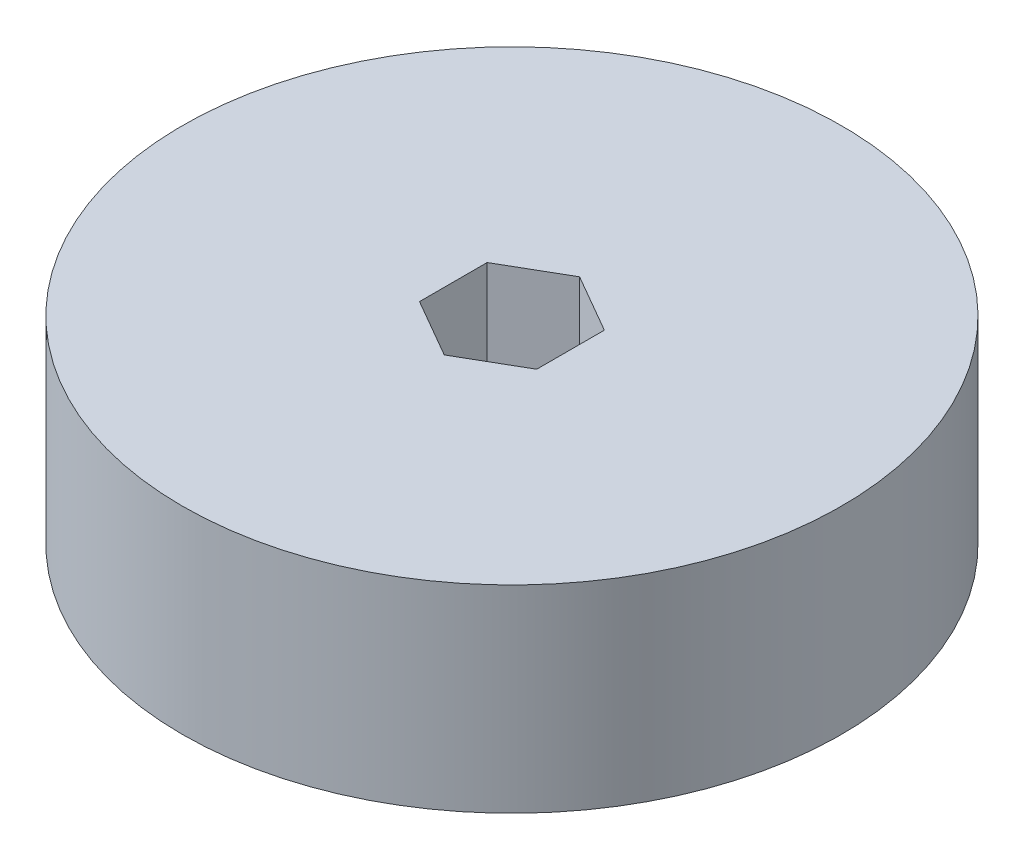
ISO-10303-21;
HEADER;
FILE_DESCRIPTION(('STEP AP214'),'2;1');
FILE_NAME('part.step','',(''),(''),'','','');
FILE_SCHEMA(('AUTOMOTIVE_DESIGN { 1 0 10303 214 1 1 1 1 }'));
ENDSEC;
DATA;
#1=APPLICATION_CONTEXT('core data for automotive mechanical design processes');
#2=APPLICATION_PROTOCOL_DEFINITION('international standard','automotive_design',2000,#1);
#3=PRODUCT_CONTEXT('',#1,'mechanical');
#4=PRODUCT('Part','Part','',(#3));
#5=PRODUCT_RELATED_PRODUCT_CATEGORY('part','',(#4));
#6=PRODUCT_DEFINITION_FORMATION('','',#4);
#7=PRODUCT_DEFINITION_CONTEXT('part definition',#1,'design');
#8=PRODUCT_DEFINITION('design','',#6,#7);
#9=PRODUCT_DEFINITION_SHAPE('','',#8);
#10=(LENGTH_UNIT() NAMED_UNIT(*) SI_UNIT(.MILLI.,.METRE.));
#11=(NAMED_UNIT(*) PLANE_ANGLE_UNIT() SI_UNIT($,.RADIAN.));
#12=(NAMED_UNIT(*) SI_UNIT($,.STERADIAN.) SOLID_ANGLE_UNIT());
#13=UNCERTAINTY_MEASURE_WITH_UNIT(LENGTH_MEASURE(1.E-05),#10,'distance_accuracy_value','');
#14=(GEOMETRIC_REPRESENTATION_CONTEXT(3) GLOBAL_UNCERTAINTY_ASSIGNED_CONTEXT((#13)) GLOBAL_UNIT_ASSIGNED_CONTEXT((#10,
#11,#12)) REPRESENTATION_CONTEXT('',''));
#15=CARTESIAN_POINT('',(0.,0.,0.));
#16=DIRECTION('',(0.,0.,1.));
#17=DIRECTION('',(1.,0.,0.));
#18=AXIS2_PLACEMENT_3D('',#15,#16,#17);
#19=CARTESIAN_POINT('',(4.44499999999999,-0.000999999999999265,-2.56632194654789));
#20=DIRECTION('',(0.5,0.,-0.866025403784439));
#21=DIRECTION('',(-0.866025403784439,0.,-0.5));
#22=AXIS2_PLACEMENT_3D('',#19,#20,#21);
#23=PLANE('',#22);
#24=DIRECTION('',(-0.866025403784439,0.,-0.5));
#25=VECTOR('',#24,1.);
#26=CARTESIAN_POINT('',(4.44499999999999,5.,-2.56632194654789));
#27=LINE('',#26,#25);
#28=CARTESIAN_POINT('',(4.44499999999999,5.,-2.56632194654789));
#29=VERTEX_POINT('',#28);
#30=CARTESIAN_POINT('',(0.,4.99999999999999,-5.13264389309577));
#31=VERTEX_POINT('',#30);
#32=EDGE_CURVE('E62',#29,#31,#27,.T.);
#33=ORIENTED_EDGE('',*,*,#32,.F.);
#34=DIRECTION('',(0.,1.,0.));
#35=VECTOR('',#34,1.);
#36=CARTESIAN_POINT('',(4.44499999999999,-0.000999999999999265,-2.56632194654789));
#37=LINE('',#36,#35);
#38=CARTESIAN_POINT('',(4.44499999999999,15.,-2.56632194654789));
#39=VERTEX_POINT('',#38);
#40=EDGE_CURVE('E375',#29,#39,#37,.T.);
#41=ORIENTED_EDGE('',*,*,#40,.T.);
#42=DIRECTION('',(-0.866025403784439,0.,-0.5));
#43=VECTOR('',#42,1.);
#44=CARTESIAN_POINT('',(4.44499999999999,15.,-2.56632194654789));
#45=LINE('',#44,#43);
#46=CARTESIAN_POINT('',(0.,15.,-5.13264389309577));
#47=VERTEX_POINT('',#46);
#48=EDGE_CURVE('E350',#39,#47,#45,.T.);
#49=ORIENTED_EDGE('',*,*,#48,.T.);
#50=DIRECTION('',(0.,1.,0.));
#51=VECTOR('',#50,1.);
#52=CARTESIAN_POINT('',(0.,-0.000999999999999265,-5.13264389309577));
#53=LINE('',#52,#51);
#54=EDGE_CURVE('E374',#31,#47,#53,.T.);
#55=ORIENTED_EDGE('',*,*,#54,.F.);
#56=EDGE_LOOP('',(#33,#41,#49,#55));
#57=FACE_BOUND('',#56,.T.);
#58=ADVANCED_FACE('F39',(#57),#23,.F.);
#59=CARTESIAN_POINT('',(4.44499999999999,-0.000999999999999265,2.56632194654789));
#60=DIRECTION('',(1.,0.,0.));
#61=DIRECTION('',(0.,0.,-1.));
#62=AXIS2_PLACEMENT_3D('',#59,#60,#61);
#63=PLANE('',#62);
#64=DIRECTION('',(0.,0.,-1.));
#65=VECTOR('',#64,1.);
#66=CARTESIAN_POINT('',(4.44499999999999,5.,2.56632194654789));
#67=LINE('',#66,#65);
#68=CARTESIAN_POINT('',(4.44499999999999,5.,2.56632194654789));
#69=VERTEX_POINT('',#68);
#70=EDGE_CURVE('E345',#69,#29,#67,.T.);
#71=ORIENTED_EDGE('',*,*,#70,.F.);
#72=DIRECTION('',(0.,1.,0.));
#73=VECTOR('',#72,1.);
#74=CARTESIAN_POINT('',(4.44499999999999,-0.000999999999999265,2.56632194654789));
#75=LINE('',#74,#73);
#76=CARTESIAN_POINT('',(4.44499999999999,15.,2.56632194654789));
#77=VERTEX_POINT('',#76);
#78=EDGE_CURVE('E379',#69,#77,#75,.T.);
#79=ORIENTED_EDGE('',*,*,#78,.T.);
#80=DIRECTION('',(0.,0.,-1.));
#81=VECTOR('',#80,1.);
#82=CARTESIAN_POINT('',(4.44499999999999,15.,2.56632194654789));
#83=LINE('',#82,#81);
#84=EDGE_CURVE('E370',#77,#39,#83,.T.);
#85=ORIENTED_EDGE('',*,*,#84,.T.);
#86=ORIENTED_EDGE('',*,*,#40,.F.);
#87=EDGE_LOOP('',(#71,#79,#85,#86));
#88=FACE_BOUND('',#87,.T.);
#89=ADVANCED_FACE('F412',(#88),#63,.F.);
#90=CARTESIAN_POINT('',(0.,-0.000999999999999265,5.13264389309577));
#91=DIRECTION('',(0.5,0.,0.866025403784438));
#92=DIRECTION('',(0.866025403784438,0.,-0.500000000000001));
#93=AXIS2_PLACEMENT_3D('',#90,#91,#92);
#94=PLANE('',#93);
#95=DIRECTION('',(0.866025403784438,0.,-0.500000000000001));
#96=VECTOR('',#95,1.);
#97=CARTESIAN_POINT('',(0.,5.,5.13264389309577));
#98=LINE('',#97,#96);
#99=CARTESIAN_POINT('',(0.,5.,5.13264389309577));
#100=VERTEX_POINT('',#99);
#101=EDGE_CURVE('E342',#100,#69,#98,.T.);
#102=ORIENTED_EDGE('',*,*,#101,.F.);
#103=DIRECTION('',(0.,1.,0.));
#104=VECTOR('',#103,1.);
#105=CARTESIAN_POINT('',(0.,-0.000999999999999265,5.13264389309577));
#106=LINE('',#105,#104);
#107=CARTESIAN_POINT('',(0.,15.,5.13264389309577));
#108=VERTEX_POINT('',#107);
#109=EDGE_CURVE('E382',#100,#108,#106,.T.);
#110=ORIENTED_EDGE('',*,*,#109,.T.);
#111=DIRECTION('',(0.866025403784438,0.,-0.5));
#112=VECTOR('',#111,1.);
#113=CARTESIAN_POINT('',(0.,15.,5.13264389309577));
#114=LINE('',#113,#112);
#115=EDGE_CURVE('E366',#108,#77,#114,.T.);
#116=ORIENTED_EDGE('',*,*,#115,.T.);
#117=ORIENTED_EDGE('',*,*,#78,.F.);
#118=EDGE_LOOP('',(#102,#110,#116,#117));
#119=FACE_BOUND('',#118,.T.);
#120=ADVANCED_FACE('F418',(#119),#94,.F.);
#121=CARTESIAN_POINT('',(-4.44500000000001,-0.000999999999999265,2.56632194654789));
#122=DIRECTION('',(-0.5,0.,0.866025403784439));
#123=DIRECTION('',(0.866025403784439,0.,0.5));
#124=AXIS2_PLACEMENT_3D('',#121,#122,#123);
#125=PLANE('',#124);
#126=DIRECTION('',(0.866025403784439,0.,0.5));
#127=VECTOR('',#126,1.);
#128=CARTESIAN_POINT('',(-4.44500000000001,5.,2.56632194654789));
#129=LINE('',#128,#127);
#130=CARTESIAN_POINT('',(-4.44500000000001,5.,2.56632194654789));
#131=VERTEX_POINT('',#130);
#132=EDGE_CURVE('E339',#131,#100,#129,.T.);
#133=ORIENTED_EDGE('',*,*,#132,.F.);
#134=DIRECTION('',(0.,1.,0.));
#135=VECTOR('',#134,1.);
#136=CARTESIAN_POINT('',(-4.44500000000001,-0.000999999999999265,2.56632194654789));
#137=LINE('',#136,#135);
#138=CARTESIAN_POINT('',(-4.44500000000001,15.,2.56632194654789));
#139=VERTEX_POINT('',#138);
#140=EDGE_CURVE('E385',#131,#139,#137,.T.);
#141=ORIENTED_EDGE('',*,*,#140,.T.);
#142=DIRECTION('',(0.866025403784439,0.,0.5));
#143=VECTOR('',#142,1.);
#144=CARTESIAN_POINT('',(-4.44500000000001,15.,2.56632194654789));
#145=LINE('',#144,#143);
#146=EDGE_CURVE('E362',#139,#108,#145,.T.);
#147=ORIENTED_EDGE('',*,*,#146,.T.);
#148=ORIENTED_EDGE('',*,*,#109,.F.);
#149=EDGE_LOOP('',(#133,#141,#147,#148));
#150=FACE_BOUND('',#149,.T.);
#151=ADVANCED_FACE('F429',(#150),#125,.F.);
#152=CARTESIAN_POINT('',(-4.44500000000001,-0.000999999999999265,-2.56632194654788));
#153=DIRECTION('',(-1.,0.,0.));
#154=DIRECTION('',(0.,0.,1.));
#155=AXIS2_PLACEMENT_3D('',#152,#153,#154);
#156=PLANE('',#155);
#157=DIRECTION('',(0.,0.,1.));
#158=VECTOR('',#157,1.);
#159=CARTESIAN_POINT('',(-4.44500000000001,5.,-2.56632194654788));
#160=LINE('',#159,#158);
#161=CARTESIAN_POINT('',(-4.44500000000001,5.,-2.56632194654788));
#162=VERTEX_POINT('',#161);
#163=EDGE_CURVE('E301',#162,#131,#160,.T.);
#164=ORIENTED_EDGE('',*,*,#163,.F.);
#165=DIRECTION('',(0.,1.,0.));
#166=VECTOR('',#165,1.);
#167=CARTESIAN_POINT('',(-4.44500000000001,-0.000999999999999265,-2.56632194654788));
#168=LINE('',#167,#166);
#169=CARTESIAN_POINT('',(-4.44500000000001,15.,-2.56632194654788));
#170=VERTEX_POINT('',#169);
#171=EDGE_CURVE('E388',#162,#170,#168,.T.);
#172=ORIENTED_EDGE('',*,*,#171,.T.);
#173=DIRECTION('',(0.,0.,1.));
#174=VECTOR('',#173,1.);
#175=CARTESIAN_POINT('',(-4.44500000000001,15.,-2.56632194654788));
#176=LINE('',#175,#174);
#177=EDGE_CURVE('E358',#170,#139,#176,.T.);
#178=ORIENTED_EDGE('',*,*,#177,.T.);
#179=ORIENTED_EDGE('',*,*,#140,.F.);
#180=EDGE_LOOP('',(#164,#172,#178,#179));
#181=FACE_BOUND('',#180,.T.);
#182=ADVANCED_FACE('F425',(#181),#156,.F.);
#183=CARTESIAN_POINT('',(0.,-0.000999999999999265,-5.13264389309577));
#184=DIRECTION('',(-0.500000000000001,0.,-0.866025403784438));
#185=DIRECTION('',(-0.866025403784438,0.,0.500000000000001));
#186=AXIS2_PLACEMENT_3D('',#183,#184,#185);
#187=PLANE('',#186);
#188=DIRECTION('',(-0.866025403784438,0.,0.500000000000001));
#189=VECTOR('',#188,1.);
#190=CARTESIAN_POINT('',(0.,5.,-5.13264389309577));
#191=LINE('',#190,#189);
#192=EDGE_CURVE('E11',#31,#162,#191,.T.);
#193=ORIENTED_EDGE('',*,*,#192,.F.);
#194=ORIENTED_EDGE('',*,*,#54,.T.);
#195=DIRECTION('',(-0.866025403784438,0.,0.500000000000001));
#196=VECTOR('',#195,1.);
#197=CARTESIAN_POINT('',(0.,15.,-5.13264389309577));
#198=LINE('',#197,#196);
#199=EDGE_CURVE('E354',#47,#170,#198,.T.);
#200=ORIENTED_EDGE('',*,*,#199,.T.);
#201=ORIENTED_EDGE('',*,*,#171,.F.);
#202=EDGE_LOOP('',(#193,#194,#200,#201));
#203=FACE_BOUND('',#202,.T.);
#204=ADVANCED_FACE('F422',(#203),#187,.F.);
#205=CARTESIAN_POINT('',(0.,15.,0.));
#206=DIRECTION('',(0.,-1.,0.));
#207=DIRECTION('',(0.,0.,-1.));
#208=AXIS2_PLACEMENT_3D('',#205,#206,#207);
#209=CYLINDRICAL_SURFACE('',#208,25.);
#210=CARTESIAN_POINT('',(0.,15.,0.));
#211=DIRECTION('',(0.,1.,0.));
#212=DIRECTION('',(0.,0.,1.));
#213=AXIS2_PLACEMENT_3D('',#210,#211,#212);
#214=CIRCLE('',#213,25.);
#215=CARTESIAN_POINT('',(0.,15.,25.));
#216=VERTEX_POINT('',#215);
#217=EDGE_CURVE('E48',#216,#216,#214,.T.);
#218=ORIENTED_EDGE('',*,*,#217,.F.);
#219=EDGE_LOOP('',(#218));
#220=FACE_BOUND('',#219,.T.);
#221=CARTESIAN_POINT('',(0.,0.,0.));
#222=DIRECTION('',(0.,1.,0.));
#223=DIRECTION('',(0.,0.,1.));
#224=AXIS2_PLACEMENT_3D('',#221,#222,#223);
#225=CIRCLE('',#224,25.);
#226=CARTESIAN_POINT('',(0.,0.,25.));
#227=VERTEX_POINT('',#226);
#228=EDGE_CURVE('E378',#227,#227,#225,.T.);
#229=ORIENTED_EDGE('',*,*,#228,.T.);
#230=EDGE_LOOP('',(#229));
#231=FACE_BOUND('',#230,.T.);
#232=ADVANCED_FACE('F41',(#220,#231),#209,.T.);
#233=CARTESIAN_POINT('',(0.,15.,0.));
#234=DIRECTION('',(0.,1.,0.));
#235=DIRECTION('',(0.,0.,1.));
#236=AXIS2_PLACEMENT_3D('',#233,#234,#235);
#237=PLANE('',#236);
#238=ORIENTED_EDGE('',*,*,#48,.F.);
#239=ORIENTED_EDGE('',*,*,#84,.F.);
#240=ORIENTED_EDGE('',*,*,#115,.F.);
#241=ORIENTED_EDGE('',*,*,#146,.F.);
#242=ORIENTED_EDGE('',*,*,#177,.F.);
#243=ORIENTED_EDGE('',*,*,#199,.F.);
#244=EDGE_LOOP('',(#238,#239,#240,#241,#242,#243));
#245=FACE_BOUND('',#244,.T.);
#246=ORIENTED_EDGE('',*,*,#217,.T.);
#247=EDGE_LOOP('',(#246));
#248=FACE_BOUND('',#247,.T.);
#249=ADVANCED_FACE('F402',(#245,#248),#237,.T.);
#250=CARTESIAN_POINT('',(0.,0.,0.));
#251=DIRECTION('',(0.,1.,0.));
#252=DIRECTION('',(0.,0.,1.));
#253=AXIS2_PLACEMENT_3D('',#250,#251,#252);
#254=PLANE('',#253);
#255=CARTESIAN_POINT('',(17.8847290850349,0.,-0.56107491716859));
#256=DIRECTION('',(0.,-1.,0.));
#257=DIRECTION('',(0.,0.,1.));
#258=AXIS2_PLACEMENT_3D('',#255,#256,#257);
#259=CIRCLE('',#258,3.11643938542762);
#260=CARTESIAN_POINT('',(21.,0.,-0.475742804709889));
#261=VERTEX_POINT('',#260);
#262=CARTESIAN_POINT('',(17.4455022656401,0.,2.52425719529011));
#263=VERTEX_POINT('',#262);
#264=EDGE_CURVE('E252',#261,#263,#259,.T.);
#265=ORIENTED_EDGE('',*,*,#264,.F.);
#266=CARTESIAN_POINT('',(17.8847290850349,0.,-0.390410692251188));
#267=DIRECTION('',(0.,-1.,0.));
#268=DIRECTION('',(0.,0.,-1.));
#269=AXIS2_PLACEMENT_3D('',#266,#267,#268);
#270=CIRCLE('',#269,3.11643938542762);
#271=CARTESIAN_POINT('',(17.4455022656401,0.,-3.47574280470989));
#272=VERTEX_POINT('',#271);
#273=EDGE_CURVE('E55',#272,#261,#270,.T.);
#274=ORIENTED_EDGE('',*,*,#273,.F.);
#275=CARTESIAN_POINT('',(-5.20599883220903,0.,107.75707594731));
#276=DIRECTION('',(0.,-1.,0.));
#277=DIRECTION('',(0.,0.,-1.));
#278=AXIS2_PLACEMENT_3D('',#275,#276,#277);
#279=CIRCLE('',#278,113.51577189759);
#280=CARTESIAN_POINT('',(8.10347319825867,0.,-4.97574280470988));
#281=VERTEX_POINT('',#280);
#282=EDGE_CURVE('E200',#281,#272,#279,.T.);
#283=ORIENTED_EDGE('',*,*,#282,.F.);
#284=CARTESIAN_POINT('',(-3.64270437307684,0.,15.1171715814549));
#285=DIRECTION('',(0.,-1.,0.));
#286=DIRECTION('',(0.,0.,-1.));
#287=AXIS2_PLACEMENT_3D('',#284,#285,#286);
#288=CIRCLE('',#287,23.2744043117561);
#289=CARTESIAN_POINT('',(2.86783245125889,0.,-7.22809204030758));
#290=VERTEX_POINT('',#289);
#291=EDGE_CURVE('E204',#290,#281,#288,.T.);
#292=ORIENTED_EDGE('',*,*,#291,.F.);
#293=CARTESIAN_POINT('',(0.,0.,-0.951485609419784));
#294=DIRECTION('',(0.,-1.,0.));
#295=DIRECTION('',(0.,0.,-1.));
#296=AXIS2_PLACEMENT_3D('',#293,#294,#295);
#297=CIRCLE('',#296,6.90074280470991);
#298=CARTESIAN_POINT('',(-2.86783245125889,0.,-7.22809204030758));
#299=VERTEX_POINT('',#298);
#300=EDGE_CURVE('E291',#299,#290,#297,.T.);
#301=ORIENTED_EDGE('',*,*,#300,.F.);
#302=CARTESIAN_POINT('',(3.64270437307683,0.,15.1171715814549));
#303=DIRECTION('',(0.,-1.,0.));
#304=DIRECTION('',(0.,0.,1.));
#305=AXIS2_PLACEMENT_3D('',#302,#303,#304);
#306=CIRCLE('',#305,23.2744043117561);
#307=CARTESIAN_POINT('',(-8.10347319825865,0.,-4.97574280470987));
#308=VERTEX_POINT('',#307);
#309=EDGE_CURVE('E287',#308,#299,#306,.T.);
#310=ORIENTED_EDGE('',*,*,#309,.F.);
#311=CARTESIAN_POINT('',(5.20599883220902,0.,107.75707594731));
#312=DIRECTION('',(0.,-1.,0.));
#313=DIRECTION('',(0.,0.,1.));
#314=AXIS2_PLACEMENT_3D('',#311,#312,#313);
#315=CIRCLE('',#314,113.51577189759);
#316=CARTESIAN_POINT('',(-17.4455022656401,0.,-3.47574280470989));
#317=VERTEX_POINT('',#316);
#318=EDGE_CURVE('E283',#317,#308,#315,.T.);
#319=ORIENTED_EDGE('',*,*,#318,.F.);
#320=CARTESIAN_POINT('',(-17.8847290850349,0.,-0.390410692251189));
#321=DIRECTION('',(0.,-1.,0.));
#322=DIRECTION('',(0.,0.,1.));
#323=AXIS2_PLACEMENT_3D('',#320,#321,#322);
#324=CIRCLE('',#323,3.11643938542762);
#325=CARTESIAN_POINT('',(-21.,0.,-0.475742804709896));
#326=VERTEX_POINT('',#325);
#327=EDGE_CURVE('E279',#326,#317,#324,.T.);
#328=ORIENTED_EDGE('',*,*,#327,.F.);
#329=CARTESIAN_POINT('',(-17.8847290850349,0.,-0.561074917168592));
#330=DIRECTION('',(0.,-1.,0.));
#331=DIRECTION('',(0.,0.,-1.));
#332=AXIS2_PLACEMENT_3D('',#329,#330,#331);
#333=CIRCLE('',#332,3.11643938542762);
#334=CARTESIAN_POINT('',(-17.4455022656401,0.,2.52425719529011));
#335=VERTEX_POINT('',#334);
#336=EDGE_CURVE('E275',#335,#326,#333,.T.);
#337=ORIENTED_EDGE('',*,*,#336,.F.);
#338=CARTESIAN_POINT('',(5.20599883220902,0.,-108.70856155673));
#339=DIRECTION('',(0.,-1.,0.));
#340=DIRECTION('',(0.,0.,-1.));
#341=AXIS2_PLACEMENT_3D('',#338,#339,#340);
#342=CIRCLE('',#341,113.51577189759);
#343=CARTESIAN_POINT('',(-8.10347319825867,0.,4.0242571952901));
#344=VERTEX_POINT('',#343);
#345=EDGE_CURVE('E271',#344,#335,#342,.T.);
#346=ORIENTED_EDGE('',*,*,#345,.F.);
#347=CARTESIAN_POINT('',(3.64270437307683,0.,-16.0686571908747));
#348=DIRECTION('',(0.,-1.,0.));
#349=DIRECTION('',(0.,0.,-1.));
#350=AXIS2_PLACEMENT_3D('',#347,#348,#349);
#351=CIRCLE('',#350,23.2744043117561);
#352=CARTESIAN_POINT('',(-2.86783245125889,0.,6.2766064308878));
#353=VERTEX_POINT('',#352);
#354=EDGE_CURVE('E267',#353,#344,#351,.T.);
#355=ORIENTED_EDGE('',*,*,#354,.F.);
#356=CARTESIAN_POINT('',(0.,0.,0.));
#357=DIRECTION('',(0.,-1.,0.));
#358=DIRECTION('',(0.,0.,-1.));
#359=AXIS2_PLACEMENT_3D('',#356,#357,#358);
#360=CIRCLE('',#359,6.90074280470991);
#361=CARTESIAN_POINT('',(2.86783245125889,0.,6.27660643088779));
#362=VERTEX_POINT('',#361);
#363=EDGE_CURVE('E263',#362,#353,#360,.T.);
#364=ORIENTED_EDGE('',*,*,#363,.F.);
#365=CARTESIAN_POINT('',(-3.64270437307683,0.,-16.0686571908747));
#366=DIRECTION('',(0.,-1.,0.));
#367=DIRECTION('',(0.,0.,1.));
#368=AXIS2_PLACEMENT_3D('',#365,#366,#367);
#369=CIRCLE('',#368,23.2744043117561);
#370=CARTESIAN_POINT('',(8.10347319825868,0.,4.02425719529009));
#371=VERTEX_POINT('',#370);
#372=EDGE_CURVE('E259',#371,#362,#369,.T.);
#373=ORIENTED_EDGE('',*,*,#372,.F.);
#374=CARTESIAN_POINT('',(-5.20599883220902,0.,-108.70856155673));
#375=DIRECTION('',(0.,-1.,0.));
#376=DIRECTION('',(0.,0.,1.));
#377=AXIS2_PLACEMENT_3D('',#374,#375,#376);
#378=CIRCLE('',#377,113.51577189759);
#379=EDGE_CURVE('E255',#263,#371,#378,.T.);
#380=ORIENTED_EDGE('',*,*,#379,.F.);
#381=EDGE_LOOP('',(#265,#274,#283,#292,#301,#310,#319,#328,#337,#346,#355,#364,#373,#380));
#382=FACE_BOUND('',#381,.T.);
#383=ORIENTED_EDGE('',*,*,#228,.F.);
#384=EDGE_LOOP('',(#383));
#385=FACE_BOUND('',#384,.T.);
#386=ADVANCED_FACE('F400',(#382,#385),#254,.F.);
#387=CARTESIAN_POINT('',(17.8847290850349,5.,-0.475742804709889));
#388=DIRECTION('',(0.,-1.,0.));
#389=DIRECTION('',(0.,0.,-1.));
#390=AXIS2_PLACEMENT_3D('',#387,#388,#389);
#391=PLANE('',#390);
#392=CARTESIAN_POINT('',(17.8847290850349,5.,-0.390410692251188));
#393=DIRECTION('',(0.,-1.,0.));
#394=DIRECTION('',(0.,0.,-1.));
#395=AXIS2_PLACEMENT_3D('',#392,#393,#394);
#396=CIRCLE('',#395,3.11643938542762);
#397=CARTESIAN_POINT('',(17.4455022656401,5.,-3.47574280470989));
#398=VERTEX_POINT('',#397);
#399=CARTESIAN_POINT('',(21.,5.,-0.475742804709889));
#400=VERTEX_POINT('',#399);
#401=EDGE_CURVE('E178',#398,#400,#396,.T.);
#402=ORIENTED_EDGE('',*,*,#401,.T.);
#403=CARTESIAN_POINT('',(17.8847290850349,5.,-0.56107491716859));
#404=DIRECTION('',(0.,-1.,0.));
#405=DIRECTION('',(0.,0.,1.));
#406=AXIS2_PLACEMENT_3D('',#403,#404,#405);
#407=CIRCLE('',#406,3.11643938542762);
#408=CARTESIAN_POINT('',(17.4455022656401,5.,2.52425719529011));
#409=VERTEX_POINT('',#408);
#410=EDGE_CURVE('E188',#400,#409,#407,.T.);
#411=ORIENTED_EDGE('',*,*,#410,.T.);
#412=CARTESIAN_POINT('',(-5.20599883220902,5.,-108.70856155673));
#413=DIRECTION('',(0.,-1.,0.));
#414=DIRECTION('',(0.,0.,1.));
#415=AXIS2_PLACEMENT_3D('',#412,#413,#414);
#416=CIRCLE('',#415,113.51577189759);
#417=CARTESIAN_POINT('',(8.10347319825868,5.,4.02425719529009));
#418=VERTEX_POINT('',#417);
#419=EDGE_CURVE('E194',#409,#418,#416,.T.);
#420=ORIENTED_EDGE('',*,*,#419,.T.);
#421=CARTESIAN_POINT('',(-3.64270437307683,5.,-16.0686571908747));
#422=DIRECTION('',(0.,-1.,0.));
#423=DIRECTION('',(0.,0.,1.));
#424=AXIS2_PLACEMENT_3D('',#421,#422,#423);
#425=CIRCLE('',#424,23.2744043117561);
#426=CARTESIAN_POINT('',(2.86783245125889,5.,6.27660643088779));
#427=VERTEX_POINT('',#426);
#428=EDGE_CURVE('E209',#418,#427,#425,.T.);
#429=ORIENTED_EDGE('',*,*,#428,.T.);
#430=CARTESIAN_POINT('',(0.,5.,0.));
#431=DIRECTION('',(0.,-1.,0.));
#432=DIRECTION('',(0.,0.,-1.));
#433=AXIS2_PLACEMENT_3D('',#430,#431,#432);
#434=CIRCLE('',#433,6.90074280470991);
#435=CARTESIAN_POINT('',(-2.86783245125889,5.,6.2766064308878));
#436=VERTEX_POINT('',#435);
#437=EDGE_CURVE('E213',#427,#436,#434,.T.);
#438=ORIENTED_EDGE('',*,*,#437,.T.);
#439=CARTESIAN_POINT('',(3.64270437307683,5.,-16.0686571908747));
#440=DIRECTION('',(0.,-1.,0.));
#441=DIRECTION('',(0.,0.,-1.));
#442=AXIS2_PLACEMENT_3D('',#439,#440,#441);
#443=CIRCLE('',#442,23.2744043117561);
#444=CARTESIAN_POINT('',(-8.10347319825867,5.,4.0242571952901));
#445=VERTEX_POINT('',#444);
#446=EDGE_CURVE('E217',#436,#445,#443,.T.);
#447=ORIENTED_EDGE('',*,*,#446,.T.);
#448=CARTESIAN_POINT('',(5.20599883220902,5.,-108.70856155673));
#449=DIRECTION('',(0.,-1.,0.));
#450=DIRECTION('',(0.,0.,-1.));
#451=AXIS2_PLACEMENT_3D('',#448,#449,#450);
#452=CIRCLE('',#451,113.51577189759);
#453=CARTESIAN_POINT('',(-17.4455022656401,5.,2.52425719529011));
#454=VERTEX_POINT('',#453);
#455=EDGE_CURVE('E221',#445,#454,#452,.T.);
#456=ORIENTED_EDGE('',*,*,#455,.T.);
#457=CARTESIAN_POINT('',(-17.8847290850349,5.,-0.561074917168592));
#458=DIRECTION('',(0.,-1.,0.));
#459=DIRECTION('',(0.,0.,-1.));
#460=AXIS2_PLACEMENT_3D('',#457,#458,#459);
#461=CIRCLE('',#460,3.11643938542762);
#462=CARTESIAN_POINT('',(-21.,5.,-0.475742804709896));
#463=VERTEX_POINT('',#462);
#464=EDGE_CURVE('E225',#454,#463,#461,.T.);
#465=ORIENTED_EDGE('',*,*,#464,.T.);
#466=CARTESIAN_POINT('',(-17.8847290850349,5.,-0.390410692251189));
#467=DIRECTION('',(0.,-1.,0.));
#468=DIRECTION('',(0.,0.,1.));
#469=AXIS2_PLACEMENT_3D('',#466,#467,#468);
#470=CIRCLE('',#469,3.11643938542762);
#471=CARTESIAN_POINT('',(-17.4455022656401,5.,-3.47574280470989));
#472=VERTEX_POINT('',#471);
#473=EDGE_CURVE('E229',#463,#472,#470,.T.);
#474=ORIENTED_EDGE('',*,*,#473,.T.);
#475=CARTESIAN_POINT('',(5.20599883220902,5.,107.75707594731));
#476=DIRECTION('',(0.,-1.,0.));
#477=DIRECTION('',(0.,0.,1.));
#478=AXIS2_PLACEMENT_3D('',#475,#476,#477);
#479=CIRCLE('',#478,113.51577189759);
#480=CARTESIAN_POINT('',(-8.10347319825865,5.,-4.97574280470987));
#481=VERTEX_POINT('',#480);
#482=EDGE_CURVE('E233',#472,#481,#479,.T.);
#483=ORIENTED_EDGE('',*,*,#482,.T.);
#484=CARTESIAN_POINT('',(3.64270437307683,5.,15.1171715814549));
#485=DIRECTION('',(0.,-1.,0.));
#486=DIRECTION('',(0.,0.,1.));
#487=AXIS2_PLACEMENT_3D('',#484,#485,#486);
#488=CIRCLE('',#487,23.2744043117561);
#489=CARTESIAN_POINT('',(-2.86783245125889,5.,-7.22809204030758));
#490=VERTEX_POINT('',#489);
#491=EDGE_CURVE('E237',#481,#490,#488,.T.);
#492=ORIENTED_EDGE('',*,*,#491,.T.);
#493=CARTESIAN_POINT('',(0.,5.,-0.951485609419784));
#494=DIRECTION('',(0.,-1.,0.));
#495=DIRECTION('',(0.,0.,-1.));
#496=AXIS2_PLACEMENT_3D('',#493,#494,#495);
#497=CIRCLE('',#496,6.90074280470991);
#498=CARTESIAN_POINT('',(2.86783245125889,5.,-7.22809204030758));
#499=VERTEX_POINT('',#498);
#500=EDGE_CURVE('E241',#490,#499,#497,.T.);
#501=ORIENTED_EDGE('',*,*,#500,.T.);
#502=CARTESIAN_POINT('',(-3.64270437307684,5.,15.1171715814549));
#503=DIRECTION('',(0.,-1.,0.));
#504=DIRECTION('',(0.,0.,-1.));
#505=AXIS2_PLACEMENT_3D('',#502,#503,#504);
#506=CIRCLE('',#505,23.2744043117561);
#507=CARTESIAN_POINT('',(8.10347319825867,5.,-4.97574280470988));
#508=VERTEX_POINT('',#507);
#509=EDGE_CURVE('E245',#499,#508,#506,.T.);
#510=ORIENTED_EDGE('',*,*,#509,.T.);
#511=CARTESIAN_POINT('',(-5.20599883220903,5.,107.75707594731));
#512=DIRECTION('',(0.,-1.,0.));
#513=DIRECTION('',(0.,0.,-1.));
#514=AXIS2_PLACEMENT_3D('',#511,#512,#513);
#515=CIRCLE('',#514,113.51577189759);
#516=EDGE_CURVE('E185',#508,#398,#515,.T.);
#517=ORIENTED_EDGE('',*,*,#516,.T.);
#518=EDGE_LOOP('',(#402,#411,#420,#429,#438,#447,#456,#465,#474,#483,#492,#501,#510,#517));
#519=FACE_BOUND('',#518,.T.);
#520=ORIENTED_EDGE('',*,*,#32,.T.);
#521=ORIENTED_EDGE('',*,*,#192,.T.);
#522=ORIENTED_EDGE('',*,*,#163,.T.);
#523=ORIENTED_EDGE('',*,*,#132,.T.);
#524=ORIENTED_EDGE('',*,*,#101,.T.);
#525=ORIENTED_EDGE('',*,*,#70,.T.);
#526=EDGE_LOOP('',(#520,#521,#522,#523,#524,#525));
#527=FACE_BOUND('',#526,.T.);
#528=ADVANCED_FACE('F196',(#519,#527),#391,.T.);
#529=CARTESIAN_POINT('',(17.8847290850349,5.,-0.390410692251188));
#530=DIRECTION('',(0.,-1.,0.));
#531=DIRECTION('',(0.,0.,-1.));
#532=AXIS2_PLACEMENT_3D('',#529,#530,#531);
#533=CYLINDRICAL_SURFACE('',#532,3.11643938542762);
#534=ORIENTED_EDGE('',*,*,#273,.T.);
#535=DIRECTION('',(0.,-1.,0.));
#536=VECTOR('',#535,1.);
#537=CARTESIAN_POINT('',(21.,5.,-0.475742804709889));
#538=LINE('',#537,#536);
#539=EDGE_CURVE('E174',#400,#261,#538,.T.);
#540=ORIENTED_EDGE('',*,*,#539,.F.);
#541=ORIENTED_EDGE('',*,*,#401,.F.);
#542=DIRECTION('',(0.,-1.,0.));
#543=VECTOR('',#542,1.);
#544=CARTESIAN_POINT('',(17.4455022656401,5.,-3.47574280470989));
#545=LINE('',#544,#543);
#546=EDGE_CURVE('E298',#398,#272,#545,.T.);
#547=ORIENTED_EDGE('',*,*,#546,.T.);
#548=EDGE_LOOP('',(#534,#540,#541,#547));
#549=FACE_BOUND('',#548,.T.);
#550=ADVANCED_FACE('F176',(#549),#533,.F.);
#551=CARTESIAN_POINT('',(-5.20599883220903,5.,107.75707594731));
#552=DIRECTION('',(0.,-1.,0.));
#553=DIRECTION('',(0.,0.,-1.));
#554=AXIS2_PLACEMENT_3D('',#551,#552,#553);
#555=CYLINDRICAL_SURFACE('',#554,113.51577189759);
#556=ORIENTED_EDGE('',*,*,#282,.T.);
#557=ORIENTED_EDGE('',*,*,#546,.F.);
#558=ORIENTED_EDGE('',*,*,#516,.F.);
#559=DIRECTION('',(0.,-1.,0.));
#560=VECTOR('',#559,1.);
#561=CARTESIAN_POINT('',(8.10347319825867,5.,-4.97574280470988));
#562=LINE('',#561,#560);
#563=EDGE_CURVE('E302',#508,#281,#562,.T.);
#564=ORIENTED_EDGE('',*,*,#563,.T.);
#565=EDGE_LOOP('',(#556,#557,#558,#564));
#566=FACE_BOUND('',#565,.T.);
#567=ADVANCED_FACE('F439',(#566),#555,.F.);
#568=CARTESIAN_POINT('',(-3.64270437307684,5.,15.1171715814549));
#569=DIRECTION('',(0.,-1.,0.));
#570=DIRECTION('',(0.,0.,-1.));
#571=AXIS2_PLACEMENT_3D('',#568,#569,#570);
#572=CYLINDRICAL_SURFACE('',#571,23.2744043117561);
#573=ORIENTED_EDGE('',*,*,#291,.T.);
#574=ORIENTED_EDGE('',*,*,#563,.F.);
#575=ORIENTED_EDGE('',*,*,#509,.F.);
#576=DIRECTION('',(0.,-1.,0.));
#577=VECTOR('',#576,1.);
#578=CARTESIAN_POINT('',(2.86783245125889,5.,-7.22809204030758));
#579=LINE('',#578,#577);
#580=EDGE_CURVE('E305',#499,#290,#579,.T.);
#581=ORIENTED_EDGE('',*,*,#580,.T.);
#582=EDGE_LOOP('',(#573,#574,#575,#581));
#583=FACE_BOUND('',#582,.T.);
#584=ADVANCED_FACE('F481',(#583),#572,.F.);
#585=CARTESIAN_POINT('',(0.,5.,-0.951485609419784));
#586=DIRECTION('',(0.,-1.,0.));
#587=DIRECTION('',(0.,0.,-1.));
#588=AXIS2_PLACEMENT_3D('',#585,#586,#587);
#589=CYLINDRICAL_SURFACE('',#588,6.90074280470991);
#590=ORIENTED_EDGE('',*,*,#300,.T.);
#591=ORIENTED_EDGE('',*,*,#580,.F.);
#592=ORIENTED_EDGE('',*,*,#500,.F.);
#593=DIRECTION('',(0.,-1.,0.));
#594=VECTOR('',#593,1.);
#595=CARTESIAN_POINT('',(-2.86783245125889,5.,-7.22809204030758));
#596=LINE('',#595,#594);
#597=EDGE_CURVE('E308',#490,#299,#596,.T.);
#598=ORIENTED_EDGE('',*,*,#597,.T.);
#599=EDGE_LOOP('',(#590,#591,#592,#598));
#600=FACE_BOUND('',#599,.T.);
#601=ADVANCED_FACE('F477',(#600),#589,.F.);
#602=CARTESIAN_POINT('',(3.64270437307683,5.,15.1171715814549));
#603=DIRECTION('',(0.,-1.,0.));
#604=DIRECTION('',(0.,0.,-1.));
#605=AXIS2_PLACEMENT_3D('',#602,#603,#604);
#606=CYLINDRICAL_SURFACE('',#605,23.2744043117561);
#607=ORIENTED_EDGE('',*,*,#309,.T.);
#608=ORIENTED_EDGE('',*,*,#597,.F.);
#609=ORIENTED_EDGE('',*,*,#491,.F.);
#610=DIRECTION('',(0.,-1.,0.));
#611=VECTOR('',#610,1.);
#612=CARTESIAN_POINT('',(-8.10347319825865,5.,-4.97574280470987));
#613=LINE('',#612,#611);
#614=EDGE_CURVE('E311',#481,#308,#613,.T.);
#615=ORIENTED_EDGE('',*,*,#614,.T.);
#616=EDGE_LOOP('',(#607,#608,#609,#615));
#617=FACE_BOUND('',#616,.T.);
#618=ADVANCED_FACE('F473',(#617),#606,.F.);
#619=CARTESIAN_POINT('',(5.20599883220902,5.,107.75707594731));
#620=DIRECTION('',(0.,-1.,0.));
#621=DIRECTION('',(0.,0.,-1.));
#622=AXIS2_PLACEMENT_3D('',#619,#620,#621);
#623=CYLINDRICAL_SURFACE('',#622,113.51577189759);
#624=ORIENTED_EDGE('',*,*,#318,.T.);
#625=ORIENTED_EDGE('',*,*,#614,.F.);
#626=ORIENTED_EDGE('',*,*,#482,.F.);
#627=DIRECTION('',(0.,-1.,0.));
#628=VECTOR('',#627,1.);
#629=CARTESIAN_POINT('',(-17.4455022656401,5.,-3.47574280470989));
#630=LINE('',#629,#628);
#631=EDGE_CURVE('E314',#472,#317,#630,.T.);
#632=ORIENTED_EDGE('',*,*,#631,.T.);
#633=EDGE_LOOP('',(#624,#625,#626,#632));
#634=FACE_BOUND('',#633,.T.);
#635=ADVANCED_FACE('F469',(#634),#623,.F.);
#636=CARTESIAN_POINT('',(-17.8847290850349,5.,-0.390410692251189));
#637=DIRECTION('',(0.,-1.,0.));
#638=DIRECTION('',(0.,0.,-1.));
#639=AXIS2_PLACEMENT_3D('',#636,#637,#638);
#640=CYLINDRICAL_SURFACE('',#639,3.11643938542762);
#641=ORIENTED_EDGE('',*,*,#327,.T.);
#642=ORIENTED_EDGE('',*,*,#631,.F.);
#643=ORIENTED_EDGE('',*,*,#473,.F.);
#644=DIRECTION('',(0.,-1.,0.));
#645=VECTOR('',#644,1.);
#646=CARTESIAN_POINT('',(-21.,5.,-0.475742804709896));
#647=LINE('',#646,#645);
#648=EDGE_CURVE('E317',#463,#326,#647,.T.);
#649=ORIENTED_EDGE('',*,*,#648,.T.);
#650=EDGE_LOOP('',(#641,#642,#643,#649));
#651=FACE_BOUND('',#650,.T.);
#652=ADVANCED_FACE('F465',(#651),#640,.F.);
#653=CARTESIAN_POINT('',(-17.8847290850349,5.,-0.561074917168592));
#654=DIRECTION('',(0.,-1.,0.));
#655=DIRECTION('',(0.,0.,-1.));
#656=AXIS2_PLACEMENT_3D('',#653,#654,#655);
#657=CYLINDRICAL_SURFACE('',#656,3.11643938542762);
#658=ORIENTED_EDGE('',*,*,#336,.T.);
#659=ORIENTED_EDGE('',*,*,#648,.F.);
#660=ORIENTED_EDGE('',*,*,#464,.F.);
#661=DIRECTION('',(0.,-1.,0.));
#662=VECTOR('',#661,1.);
#663=CARTESIAN_POINT('',(-17.4455022656401,5.,2.52425719529011));
#664=LINE('',#663,#662);
#665=EDGE_CURVE('E320',#454,#335,#664,.T.);
#666=ORIENTED_EDGE('',*,*,#665,.T.);
#667=EDGE_LOOP('',(#658,#659,#660,#666));
#668=FACE_BOUND('',#667,.T.);
#669=ADVANCED_FACE('F461',(#668),#657,.F.);
#670=CARTESIAN_POINT('',(5.20599883220902,5.,-108.70856155673));
#671=DIRECTION('',(0.,-1.,0.));
#672=DIRECTION('',(0.,0.,-1.));
#673=AXIS2_PLACEMENT_3D('',#670,#671,#672);
#674=CYLINDRICAL_SURFACE('',#673,113.51577189759);
#675=ORIENTED_EDGE('',*,*,#345,.T.);
#676=ORIENTED_EDGE('',*,*,#665,.F.);
#677=ORIENTED_EDGE('',*,*,#455,.F.);
#678=DIRECTION('',(0.,-1.,0.));
#679=VECTOR('',#678,1.);
#680=CARTESIAN_POINT('',(-8.10347319825867,5.,4.0242571952901));
#681=LINE('',#680,#679);
#682=EDGE_CURVE('E323',#445,#344,#681,.T.);
#683=ORIENTED_EDGE('',*,*,#682,.T.);
#684=EDGE_LOOP('',(#675,#676,#677,#683));
#685=FACE_BOUND('',#684,.T.);
#686=ADVANCED_FACE('F457',(#685),#674,.F.);
#687=CARTESIAN_POINT('',(3.64270437307683,5.,-16.0686571908747));
#688=DIRECTION('',(0.,-1.,0.));
#689=DIRECTION('',(0.,0.,-1.));
#690=AXIS2_PLACEMENT_3D('',#687,#688,#689);
#691=CYLINDRICAL_SURFACE('',#690,23.2744043117561);
#692=ORIENTED_EDGE('',*,*,#354,.T.);
#693=ORIENTED_EDGE('',*,*,#682,.F.);
#694=ORIENTED_EDGE('',*,*,#446,.F.);
#695=DIRECTION('',(0.,-1.,0.));
#696=VECTOR('',#695,1.);
#697=CARTESIAN_POINT('',(-2.86783245125889,5.,6.2766064308878));
#698=LINE('',#697,#696);
#699=EDGE_CURVE('E326',#436,#353,#698,.T.);
#700=ORIENTED_EDGE('',*,*,#699,.T.);
#701=EDGE_LOOP('',(#692,#693,#694,#700));
#702=FACE_BOUND('',#701,.T.);
#703=ADVANCED_FACE('F453',(#702),#691,.F.);
#704=CARTESIAN_POINT('',(0.,5.,0.));
#705=DIRECTION('',(0.,-1.,0.));
#706=DIRECTION('',(0.,0.,-1.));
#707=AXIS2_PLACEMENT_3D('',#704,#705,#706);
#708=CYLINDRICAL_SURFACE('',#707,6.90074280470991);
#709=ORIENTED_EDGE('',*,*,#363,.T.);
#710=ORIENTED_EDGE('',*,*,#699,.F.);
#711=ORIENTED_EDGE('',*,*,#437,.F.);
#712=DIRECTION('',(0.,-1.,0.));
#713=VECTOR('',#712,1.);
#714=CARTESIAN_POINT('',(2.86783245125889,5.,6.27660643088779));
#715=LINE('',#714,#713);
#716=EDGE_CURVE('E329',#427,#362,#715,.T.);
#717=ORIENTED_EDGE('',*,*,#716,.T.);
#718=EDGE_LOOP('',(#709,#710,#711,#717));
#719=FACE_BOUND('',#718,.T.);
#720=ADVANCED_FACE('F449',(#719),#708,.F.);
#721=CARTESIAN_POINT('',(-3.64270437307683,5.,-16.0686571908747));
#722=DIRECTION('',(0.,-1.,0.));
#723=DIRECTION('',(0.,0.,-1.));
#724=AXIS2_PLACEMENT_3D('',#721,#722,#723);
#725=CYLINDRICAL_SURFACE('',#724,23.2744043117561);
#726=ORIENTED_EDGE('',*,*,#372,.T.);
#727=ORIENTED_EDGE('',*,*,#716,.F.);
#728=ORIENTED_EDGE('',*,*,#428,.F.);
#729=DIRECTION('',(0.,-1.,0.));
#730=VECTOR('',#729,1.);
#731=CARTESIAN_POINT('',(8.10347319825868,5.,4.02425719529009));
#732=LINE('',#731,#730);
#733=EDGE_CURVE('E332',#418,#371,#732,.T.);
#734=ORIENTED_EDGE('',*,*,#733,.T.);
#735=EDGE_LOOP('',(#726,#727,#728,#734));
#736=FACE_BOUND('',#735,.T.);
#737=ADVANCED_FACE('F445',(#736),#725,.F.);
#738=CARTESIAN_POINT('',(-5.20599883220902,5.,-108.70856155673));
#739=DIRECTION('',(0.,-1.,0.));
#740=DIRECTION('',(0.,0.,-1.));
#741=AXIS2_PLACEMENT_3D('',#738,#739,#740);
#742=CYLINDRICAL_SURFACE('',#741,113.51577189759);
#743=ORIENTED_EDGE('',*,*,#379,.T.);
#744=ORIENTED_EDGE('',*,*,#733,.F.);
#745=ORIENTED_EDGE('',*,*,#419,.F.);
#746=DIRECTION('',(0.,-1.,0.));
#747=VECTOR('',#746,1.);
#748=CARTESIAN_POINT('',(17.4455022656401,5.,2.52425719529011));
#749=LINE('',#748,#747);
#750=EDGE_CURVE('E184',#409,#263,#749,.T.);
#751=ORIENTED_EDGE('',*,*,#750,.T.);
#752=EDGE_LOOP('',(#743,#744,#745,#751));
#753=FACE_BOUND('',#752,.T.);
#754=ADVANCED_FACE('F442',(#753),#742,.F.);
#755=CARTESIAN_POINT('',(17.8847290850349,5.,-0.56107491716859));
#756=DIRECTION('',(0.,-1.,0.));
#757=DIRECTION('',(0.,0.,-1.));
#758=AXIS2_PLACEMENT_3D('',#755,#756,#757);
#759=CYLINDRICAL_SURFACE('',#758,3.11643938542762);
#760=ORIENTED_EDGE('',*,*,#264,.T.);
#761=ORIENTED_EDGE('',*,*,#750,.F.);
#762=ORIENTED_EDGE('',*,*,#410,.F.);
#763=ORIENTED_EDGE('',*,*,#539,.T.);
#764=EDGE_LOOP('',(#760,#761,#762,#763));
#765=FACE_BOUND('',#764,.T.);
#766=ADVANCED_FACE('F189',(#765),#759,.F.);
#767=CLOSED_SHELL('',(#58,#89,#120,#151,#182,#204,#232,#249,#386,#528,#550,#567,#584,#601,#618,
#635,#652,#669,#686,#703,#720,#737,#754,#766));
#768=MANIFOLD_SOLID_BREP('B2',#767);
#769=ADVANCED_BREP_SHAPE_REPRESENTATION('',(#18,#768),#14);
#770=SHAPE_DEFINITION_REPRESENTATION(#9,#769);
ENDSEC;
END-ISO-10303-21;
